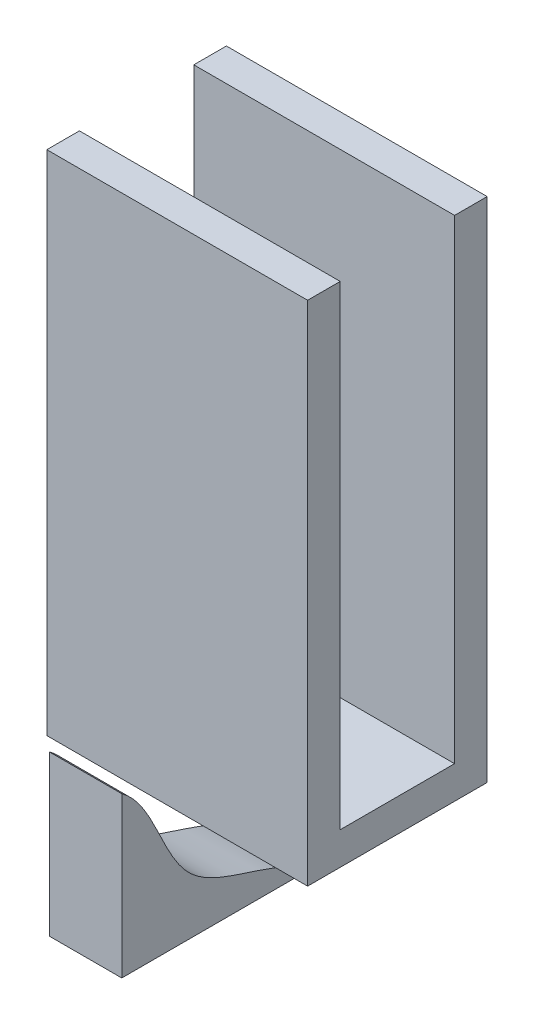
ISO-10303-21;
HEADER;
FILE_DESCRIPTION(('STEP AP214'),'2;1');
FILE_NAME('part.step','',(''),(''),'','','');
FILE_SCHEMA(('AUTOMOTIVE_DESIGN { 1 0 10303 214 1 1 1 1 }'));
ENDSEC;
DATA;
#1=APPLICATION_CONTEXT('core data for automotive mechanical design processes');
#2=APPLICATION_PROTOCOL_DEFINITION('international standard','automotive_design',2000,#1);
#3=PRODUCT_CONTEXT('',#1,'mechanical');
#4=PRODUCT('Part','Part','',(#3));
#5=PRODUCT_RELATED_PRODUCT_CATEGORY('part','',(#4));
#6=PRODUCT_DEFINITION_FORMATION('','',#4);
#7=PRODUCT_DEFINITION_CONTEXT('part definition',#1,'design');
#8=PRODUCT_DEFINITION('design','',#6,#7);
#9=PRODUCT_DEFINITION_SHAPE('','',#8);
#10=(LENGTH_UNIT() NAMED_UNIT(*) SI_UNIT(.MILLI.,.METRE.));
#11=(NAMED_UNIT(*) PLANE_ANGLE_UNIT() SI_UNIT($,.RADIAN.));
#12=(NAMED_UNIT(*) SI_UNIT($,.STERADIAN.) SOLID_ANGLE_UNIT());
#13=UNCERTAINTY_MEASURE_WITH_UNIT(LENGTH_MEASURE(1.E-05),#10,'distance_accuracy_value','');
#14=(GEOMETRIC_REPRESENTATION_CONTEXT(3) GLOBAL_UNCERTAINTY_ASSIGNED_CONTEXT((#13)) GLOBAL_UNIT_ASSIGNED_CONTEXT((#10,
#11,#12)) REPRESENTATION_CONTEXT('',''));
#15=CARTESIAN_POINT('',(0.,0.,0.));
#16=DIRECTION('',(0.,0.,1.));
#17=DIRECTION('',(1.,0.,0.));
#18=AXIS2_PLACEMENT_3D('',#15,#16,#17);
#19=CARTESIAN_POINT('',(-20.,-45.2531458099855,-6.6055019568257));
#20=DIRECTION('',(0.,1.,0.));
#21=DIRECTION('',(0.,0.,1.));
#22=AXIS2_PLACEMENT_3D('',#19,#20,#21);
#23=PLANE('',#22);
#24=DIRECTION('',(1.,0.,0.));
#25=VECTOR('',#24,1.);
#26=CARTESIAN_POINT('',(-20.,-45.2531458099855,10.9381302617935));
#27=LINE('',#26,#25);
#28=CARTESIAN_POINT('',(-20.,-45.2531458099855,10.9381302617935));
#29=VERTEX_POINT('',#28);
#30=CARTESIAN_POINT('',(20.,-45.2531458099855,10.9381302617935));
#31=VERTEX_POINT('',#30);
#32=EDGE_CURVE('E124',#29,#31,#27,.T.);
#33=ORIENTED_EDGE('',*,*,#32,.T.);
#34=DIRECTION('',(0.,0.,1.));
#35=VECTOR('',#34,1.);
#36=CARTESIAN_POINT('',(20.,-45.2531458099855,-6.6055019568257));
#37=LINE('',#36,#35);
#38=CARTESIAN_POINT('',(20.,-45.2531458099855,-6.6055019568257));
#39=VERTEX_POINT('',#38);
#40=EDGE_CURVE('E185',#39,#31,#37,.T.);
#41=ORIENTED_EDGE('',*,*,#40,.F.);
#42=DIRECTION('',(1.,0.,0.));
#43=VECTOR('',#42,1.);
#44=CARTESIAN_POINT('',(-20.,-45.2531458099855,-6.6055019568257));
#45=LINE('',#44,#43);
#46=CARTESIAN_POINT('',(-20.,-45.2531458099855,-6.6055019568257));
#47=VERTEX_POINT('',#46);
#48=EDGE_CURVE('E50',#47,#39,#45,.T.);
#49=ORIENTED_EDGE('',*,*,#48,.F.);
#50=DIRECTION('',(0.,0.,1.));
#51=VECTOR('',#50,1.);
#52=CARTESIAN_POINT('',(-20.,-45.2531458099855,-6.6055019568257));
#53=LINE('',#52,#51);
#54=EDGE_CURVE('E186',#47,#29,#53,.T.);
#55=ORIENTED_EDGE('',*,*,#54,.T.);
#56=EDGE_LOOP('',(#33,#41,#49,#55));
#57=FACE_BOUND('',#56,.T.);
#58=ADVANCED_FACE('F121',(#57),#23,.T.);
#59=CARTESIAN_POINT('',(-20.,-45.2531458099855,-6.6055019568257));
#60=DIRECTION('',(0.,0.,1.));
#61=DIRECTION('',(1.,0.,0.));
#62=AXIS2_PLACEMENT_3D('',#59,#60,#61);
#63=PLANE('',#62);
#64=ORIENTED_EDGE('',*,*,#48,.T.);
#65=DIRECTION('',(0.,-1.,0.));
#66=VECTOR('',#65,1.);
#67=CARTESIAN_POINT('',(20.,-45.2531458099855,-6.6055019568257));
#68=LINE('',#67,#66);
#69=CARTESIAN_POINT('',(20.,27.5804653060911,-6.6055019568257));
#70=VERTEX_POINT('',#69);
#71=EDGE_CURVE('E203',#70,#39,#68,.T.);
#72=ORIENTED_EDGE('',*,*,#71,.F.);
#73=DIRECTION('',(1.,0.,0.));
#74=VECTOR('',#73,1.);
#75=CARTESIAN_POINT('',(-20.,27.5804653060911,-6.6055019568257));
#76=LINE('',#75,#74);
#77=CARTESIAN_POINT('',(-20.,27.5804653060911,-6.6055019568257));
#78=VERTEX_POINT('',#77);
#79=EDGE_CURVE('E129',#78,#70,#76,.T.);
#80=ORIENTED_EDGE('',*,*,#79,.F.);
#81=DIRECTION('',(0.,-1.,0.));
#82=VECTOR('',#81,1.);
#83=CARTESIAN_POINT('',(-20.,-45.2531458099855,-6.6055019568257));
#84=LINE('',#83,#82);
#85=EDGE_CURVE('E191',#78,#47,#84,.T.);
#86=ORIENTED_EDGE('',*,*,#85,.T.);
#87=EDGE_LOOP('',(#64,#72,#80,#86));
#88=FACE_BOUND('',#87,.T.);
#89=ADVANCED_FACE('F267',(#88),#63,.T.);
#90=CARTESIAN_POINT('',(-20.,27.5804653060911,-6.6055019568257));
#91=DIRECTION('',(0.,1.,0.));
#92=DIRECTION('',(0.,0.,1.));
#93=AXIS2_PLACEMENT_3D('',#90,#91,#92);
#94=PLANE('',#93);
#95=ORIENTED_EDGE('',*,*,#79,.T.);
#96=DIRECTION('',(0.,0.,1.));
#97=VECTOR('',#96,1.);
#98=CARTESIAN_POINT('',(20.,27.5804653060911,-6.6055019568257));
#99=LINE('',#98,#97);
#100=CARTESIAN_POINT('',(20.,27.5804653060911,-11.6055019568257));
#101=VERTEX_POINT('',#100);
#102=EDGE_CURVE('E216',#101,#70,#99,.T.);
#103=ORIENTED_EDGE('',*,*,#102,.F.);
#104=DIRECTION('',(1.,0.,0.));
#105=VECTOR('',#104,1.);
#106=CARTESIAN_POINT('',(-20.,27.5804653060911,-11.6055019568257));
#107=LINE('',#106,#105);
#108=CARTESIAN_POINT('',(-20.,27.5804653060911,-11.6055019568257));
#109=VERTEX_POINT('',#108);
#110=EDGE_CURVE('E238',#109,#101,#107,.T.);
#111=ORIENTED_EDGE('',*,*,#110,.F.);
#112=DIRECTION('',(0.,0.,1.));
#113=VECTOR('',#112,1.);
#114=CARTESIAN_POINT('',(-20.,27.5804653060911,-6.6055019568257));
#115=LINE('',#114,#113);
#116=EDGE_CURVE('E234',#109,#78,#115,.T.);
#117=ORIENTED_EDGE('',*,*,#116,.T.);
#118=EDGE_LOOP('',(#95,#103,#111,#117));
#119=FACE_BOUND('',#118,.T.);
#120=ADVANCED_FACE('F266',(#119),#94,.T.);
#121=CARTESIAN_POINT('',(-20.,-50.2531458099855,-11.6055019568257));
#122=DIRECTION('',(0.,0.,-1.));
#123=DIRECTION('',(-1.,0.,0.));
#124=AXIS2_PLACEMENT_3D('',#121,#122,#123);
#125=PLANE('',#124);
#126=ORIENTED_EDGE('',*,*,#110,.T.);
#127=DIRECTION('',(0.,1.,0.));
#128=VECTOR('',#127,1.);
#129=CARTESIAN_POINT('',(20.,-50.2531458099855,-11.6055019568257));
#130=LINE('',#129,#128);
#131=CARTESIAN_POINT('',(20.,-50.2531458099855,-11.6055019568257));
#132=VERTEX_POINT('',#131);
#133=EDGE_CURVE('E213',#132,#101,#130,.T.);
#134=ORIENTED_EDGE('',*,*,#133,.F.);
#135=DIRECTION('',(1.,0.,0.));
#136=VECTOR('',#135,1.);
#137=CARTESIAN_POINT('',(-20.,-50.2531458099855,-11.6055019568257));
#138=LINE('',#137,#136);
#139=CARTESIAN_POINT('',(-20.,-50.2531458099855,-11.6055019568257));
#140=VERTEX_POINT('',#139);
#141=EDGE_CURVE('E240',#140,#132,#138,.T.);
#142=ORIENTED_EDGE('',*,*,#141,.F.);
#143=DIRECTION('',(0.,1.,0.));
#144=VECTOR('',#143,1.);
#145=CARTESIAN_POINT('',(-20.,-50.2531458099855,-11.6055019568257));
#146=LINE('',#145,#144);
#147=EDGE_CURVE('E231',#140,#109,#146,.T.);
#148=ORIENTED_EDGE('',*,*,#147,.T.);
#149=EDGE_LOOP('',(#126,#134,#142,#148));
#150=FACE_BOUND('',#149,.T.);
#151=ADVANCED_FACE('F262',(#150),#125,.T.);
#152=CARTESIAN_POINT('',(-20.,-50.2531458099855,-11.6055019568257));
#153=DIRECTION('',(0.,-1.,0.));
#154=DIRECTION('',(0.,0.,-1.));
#155=AXIS2_PLACEMENT_3D('',#152,#153,#154);
#156=PLANE('',#155);
#157=ORIENTED_EDGE('',*,*,#141,.T.);
#158=DIRECTION('',(0.,0.,-1.));
#159=VECTOR('',#158,1.);
#160=CARTESIAN_POINT('',(20.,-50.2531458099855,-11.6055019568257));
#161=LINE('',#160,#159);
#162=CARTESIAN_POINT('',(20.,-50.2531458099855,15.9381302617935));
#163=VERTEX_POINT('',#162);
#164=EDGE_CURVE('E210',#163,#132,#161,.T.);
#165=ORIENTED_EDGE('',*,*,#164,.F.);
#166=DIRECTION('',(1.,0.,0.));
#167=VECTOR('',#166,1.);
#168=CARTESIAN_POINT('',(-20.,-50.2531458099855,15.9381302617935));
#169=LINE('',#168,#167);
#170=CARTESIAN_POINT('',(-20.,-50.2531458099855,15.9381302617935));
#171=VERTEX_POINT('',#170);
#172=EDGE_CURVE('E242',#171,#163,#169,.T.);
#173=ORIENTED_EDGE('',*,*,#172,.F.);
#174=DIRECTION('',(0.,0.,-1.));
#175=VECTOR('',#174,1.);
#176=CARTESIAN_POINT('',(-20.,-50.2531458099855,-11.6055019568257));
#177=LINE('',#176,#175);
#178=EDGE_CURVE('E228',#171,#140,#177,.T.);
#179=ORIENTED_EDGE('',*,*,#178,.T.);
#180=EDGE_LOOP('',(#157,#165,#173,#179));
#181=FACE_BOUND('',#180,.T.);
#182=ADVANCED_FACE('F255',(#181),#156,.T.);
#183=CARTESIAN_POINT('',(-20.,-50.2531458099855,15.9381302617935));
#184=DIRECTION('',(0.,0.,1.));
#185=DIRECTION('',(1.,0.,0.));
#186=AXIS2_PLACEMENT_3D('',#183,#184,#185);
#187=PLANE('',#186);
#188=ORIENTED_EDGE('',*,*,#172,.T.);
#189=DIRECTION('',(0.,-1.,0.));
#190=VECTOR('',#189,1.);
#191=CARTESIAN_POINT('',(20.,-50.2531458099855,15.9381302617935));
#192=LINE('',#191,#190);
#193=CARTESIAN_POINT('',(20.,27.5804653060911,15.9381302617935));
#194=VERTEX_POINT('',#193);
#195=EDGE_CURVE('E207',#194,#163,#192,.T.);
#196=ORIENTED_EDGE('',*,*,#195,.F.);
#197=DIRECTION('',(1.,0.,0.));
#198=VECTOR('',#197,1.);
#199=CARTESIAN_POINT('',(-20.,27.5804653060911,15.9381302617935));
#200=LINE('',#199,#198);
#201=CARTESIAN_POINT('',(-20.,27.5804653060911,15.9381302617935));
#202=VERTEX_POINT('',#201);
#203=EDGE_CURVE('E244',#202,#194,#200,.T.);
#204=ORIENTED_EDGE('',*,*,#203,.F.);
#205=DIRECTION('',(0.,-1.,0.));
#206=VECTOR('',#205,1.);
#207=CARTESIAN_POINT('',(-20.,-50.2531458099855,15.9381302617935));
#208=LINE('',#207,#206);
#209=EDGE_CURVE('E225',#202,#171,#208,.T.);
#210=ORIENTED_EDGE('',*,*,#209,.T.);
#211=EDGE_LOOP('',(#188,#196,#204,#210));
#212=FACE_BOUND('',#211,.T.);
#213=ADVANCED_FACE('F252',(#212),#187,.T.);
#214=CARTESIAN_POINT('',(-20.,27.5804653060911,15.9381302617935));
#215=DIRECTION('',(0.,1.,0.));
#216=DIRECTION('',(0.,0.,1.));
#217=AXIS2_PLACEMENT_3D('',#214,#215,#216);
#218=PLANE('',#217);
#219=ORIENTED_EDGE('',*,*,#203,.T.);
#220=DIRECTION('',(0.,0.,1.));
#221=VECTOR('',#220,1.);
#222=CARTESIAN_POINT('',(20.,27.5804653060911,15.9381302617935));
#223=LINE('',#222,#221);
#224=CARTESIAN_POINT('',(20.,27.5804653060911,10.9381302617935));
#225=VERTEX_POINT('',#224);
#226=EDGE_CURVE('E198',#225,#194,#223,.T.);
#227=ORIENTED_EDGE('',*,*,#226,.F.);
#228=DIRECTION('',(1.,0.,0.));
#229=VECTOR('',#228,1.);
#230=CARTESIAN_POINT('',(-20.,27.5804653060911,10.9381302617935));
#231=LINE('',#230,#229);
#232=CARTESIAN_POINT('',(-20.,27.5804653060911,10.9381302617935));
#233=VERTEX_POINT('',#232);
#234=EDGE_CURVE('E190',#233,#225,#231,.T.);
#235=ORIENTED_EDGE('',*,*,#234,.F.);
#236=DIRECTION('',(0.,0.,1.));
#237=VECTOR('',#236,1.);
#238=CARTESIAN_POINT('',(-20.,27.5804653060911,15.9381302617935));
#239=LINE('',#238,#237);
#240=EDGE_CURVE('E222',#233,#202,#239,.T.);
#241=ORIENTED_EDGE('',*,*,#240,.T.);
#242=EDGE_LOOP('',(#219,#227,#235,#241));
#243=FACE_BOUND('',#242,.T.);
#244=ADVANCED_FACE('F246',(#243),#218,.T.);
#245=CARTESIAN_POINT('',(-20.,-45.2531458099855,10.9381302617935));
#246=DIRECTION('',(0.,0.,-1.));
#247=DIRECTION('',(-1.,0.,0.));
#248=AXIS2_PLACEMENT_3D('',#245,#246,#247);
#249=PLANE('',#248);
#250=ORIENTED_EDGE('',*,*,#234,.T.);
#251=DIRECTION('',(0.,1.,0.));
#252=VECTOR('',#251,1.);
#253=CARTESIAN_POINT('',(20.,-45.2531458099855,10.9381302617935));
#254=LINE('',#253,#252);
#255=EDGE_CURVE('E193',#31,#225,#254,.T.);
#256=ORIENTED_EDGE('',*,*,#255,.F.);
#257=ORIENTED_EDGE('',*,*,#32,.F.);
#258=DIRECTION('',(0.,1.,0.));
#259=VECTOR('',#258,1.);
#260=CARTESIAN_POINT('',(-20.,-45.2531458099855,10.9381302617935));
#261=LINE('',#260,#259);
#262=EDGE_CURVE('E220',#29,#233,#261,.T.);
#263=ORIENTED_EDGE('',*,*,#262,.T.);
#264=EDGE_LOOP('',(#250,#256,#257,#263));
#265=FACE_BOUND('',#264,.T.);
#266=ADVANCED_FACE('F194',(#265),#249,.T.);
#267=CARTESIAN_POINT('',(-20.,0.,-70.));
#268=DIRECTION('',(-1.,0.,0.));
#269=DIRECTION('',(0.,0.,1.));
#270=AXIS2_PLACEMENT_3D('',#267,#268,#269);
#271=PLANE('',#270);
#272=ORIENTED_EDGE('',*,*,#54,.F.);
#273=ORIENTED_EDGE('',*,*,#85,.F.);
#274=ORIENTED_EDGE('',*,*,#116,.F.);
#275=ORIENTED_EDGE('',*,*,#147,.F.);
#276=ORIENTED_EDGE('',*,*,#178,.F.);
#277=ORIENTED_EDGE('',*,*,#209,.F.);
#278=ORIENTED_EDGE('',*,*,#240,.F.);
#279=ORIENTED_EDGE('',*,*,#262,.F.);
#280=EDGE_LOOP('',(#272,#273,#274,#275,#276,#277,#278,#279));
#281=FACE_BOUND('',#280,.T.);
#282=ADVANCED_FACE('F258',(#281),#271,.T.);
#283=CARTESIAN_POINT('',(20.,0.,-70.));
#284=DIRECTION('',(-1.,0.,0.));
#285=DIRECTION('',(0.,0.,1.));
#286=AXIS2_PLACEMENT_3D('',#283,#284,#285);
#287=PLANE('',#286);
#288=ORIENTED_EDGE('',*,*,#40,.T.);
#289=ORIENTED_EDGE('',*,*,#255,.T.);
#290=ORIENTED_EDGE('',*,*,#226,.T.);
#291=ORIENTED_EDGE('',*,*,#195,.T.);
#292=ORIENTED_EDGE('',*,*,#164,.T.);
#293=ORIENTED_EDGE('',*,*,#133,.T.);
#294=ORIENTED_EDGE('',*,*,#102,.T.);
#295=ORIENTED_EDGE('',*,*,#71,.T.);
#296=EDGE_LOOP('',(#288,#289,#290,#291,#292,#293,#294,#295));
#297=FACE_BOUND('',#296,.T.);
#298=ADVANCED_FACE('F201',(#297),#287,.F.);
#299=CLOSED_SHELL('',(#58,#89,#120,#151,#182,#213,#244,#266,#282,#298));
#300=MANIFOLD_SOLID_BREP('B6',#299);
#301=CARTESIAN_POINT('',(0.,-36.8210870869659,40.5237731026121));
#302=CARTESIAN_POINT('',(0.,-33.3118553670702,25.1176072235687));
#303=CARTESIAN_POINT('',(0.,-61.7215890433346,26.7426652328646));
#304=CARTESIAN_POINT('',(0.,-57.8458147883083,0.702636395193637));
#305=CARTESIAN_POINT('',(0.,-68.3475748648418,-2.08737019533879));
#306=B_SPLINE_CURVE_WITH_KNOTS('',3,(#301,#302,#303,#304,#305),.UNSPECIFIED.,.F.,.F.,(4,1,4),
(0.,0.518621459530431,1.),.UNSPECIFIED.);
#307=DIRECTION('',(1.,0.,0.));
#308=VECTOR('',#307,1.);
#309=SURFACE_OF_LINEAR_EXTRUSION('',#306,#308);
#310=OFFSET_SURFACE('',#309,0.02,.F.);
#311=DIRECTION('',(1.,0.,0.));
#312=VECTOR('',#311,1.);
#313=CARTESIAN_POINT('',(0.,-38.1621288129392,30.));
#314=LINE('',#313,#312);
#315=CARTESIAN_POINT('',(-5.5576064521285,-38.1621288129392,30.));
#316=VERTEX_POINT('',#315);
#317=CARTESIAN_POINT('',(5.5576064521285,-38.1621288129392,30.));
#318=VERTEX_POINT('',#317);
#319=EDGE_CURVE('E119',#316,#318,#314,.T.);
#320=ORIENTED_EDGE('',*,*,#319,.T.);
#321=CARTESIAN_POINT('',(5.5576064521285,-38.162128812939,30.0000000000001));
#322=CARTESIAN_POINT('',(5.5576064521285,-38.2390356697093,29.8932156569232));
#323=CARTESIAN_POINT('',(5.5576064521285,-38.3180935265017,29.7880025490872));
#324=CARTESIAN_POINT('',(5.5576064521285,-38.4802518566458,29.5807654114079));
#325=CARTESIAN_POINT('',(5.5576064521285,-38.56335166793,29.4787408637492));
#326=CARTESIAN_POINT('',(5.5576064521285,-38.81757188996,29.1784040563975));
#327=CARTESIAN_POINT('',(5.5576064521285,-38.9943342558284,28.9848334944389));
#328=CARTESIAN_POINT('',(5.5576064521285,-39.3604515569888,28.6105681302833));
#329=CARTESIAN_POINT('',(5.5576064521285,-39.5497904730152,28.4298575335943));
#330=CARTESIAN_POINT('',(5.5576064521285,-39.9352725684418,28.0838762866036));
#331=CARTESIAN_POINT('',(5.5576064521285,-40.1312048756993,27.9183696646933));
#332=CARTESIAN_POINT('',(5.5576064521285,-40.5317121870961,27.5977867919598));
#333=CARTESIAN_POINT('',(5.5576064521285,-40.7362958300207,27.4427213876911));
#334=CARTESIAN_POINT('',(5.5576064521285,-41.152390227305,27.1420697138918));
#335=CARTESIAN_POINT('',(5.5576064521285,-41.363903452875,26.996486882554));
#336=CARTESIAN_POINT('',(5.5576064521285,-41.8523346456861,26.6741365107189));
#337=CARTESIAN_POINT('',(5.5576064521285,-42.1310043153771,26.5000309952204));
#338=CARTESIAN_POINT('',(5.5576064521285,-42.6948931228931,26.1630220700723));
#339=CARTESIAN_POINT('',(5.5576064521285,-42.9801108025325,26.000116198025));
#340=CARTESIAN_POINT('',(5.5576064521285,-43.5553064677531,25.6829641473879));
#341=CARTESIAN_POINT('',(5.5576064521285,-43.8452846583786,25.5287183430752));
#342=CARTESIAN_POINT('',(5.5576064521285,-44.431265247978,25.2250503381148));
#343=CARTESIAN_POINT('',(5.5576064521285,-44.7272987500749,25.0756885766084));
#344=CARTESIAN_POINT('',(5.5576064521285,-45.3213149264399,24.7810015965398));
#345=CARTESIAN_POINT('',(5.5576064521285,-45.6192973857167,24.635675941729));
#346=CARTESIAN_POINT('',(5.5576064521285,-46.2160880606755,24.3467368814545));
#347=CARTESIAN_POINT('',(5.5576064521285,-46.514896280846,24.2031234853205));
#348=CARTESIAN_POINT('',(5.5576064521285,-47.0553109454691,23.9427512787087));
#349=CARTESIAN_POINT('',(5.5576064521285,-47.296964782588,23.826091249524));
#350=CARTESIAN_POINT('',(5.5576064521285,-47.7794920738743,23.5911748814192));
#351=CARTESIAN_POINT('',(5.5576064521285,-48.0203655452178,23.4729185779337));
#352=CARTESIAN_POINT('',(5.5576064521285,-48.5007154393345,23.233546927066));
#353=CARTESIAN_POINT('',(5.5576064521285,-48.7401917611856,23.1124313762602));
#354=CARTESIAN_POINT('',(5.5576064521285,-49.2170975329748,22.8660098648867));
#355=CARTESIAN_POINT('',(5.5576064521285,-49.4545262184846,22.7407024179066));
#356=CARTESIAN_POINT('',(5.5576064521285,-49.9246889047321,22.4855227482267));
#357=CARTESIAN_POINT('',(5.5576064521285,-50.1574445297613,22.3556905555566));
#358=CARTESIAN_POINT('',(5.5576064521285,-50.6190497028233,22.0892281820119));
#359=CARTESIAN_POINT('',(5.5576064521285,-50.8478992838646,21.9525980586221));
#360=CARTESIAN_POINT('',(5.5576064521285,-51.3004362816496,21.671160974459));
#361=CARTESIAN_POINT('',(5.5576064521285,-51.5241253331357,21.5263566546197));
#362=CARTESIAN_POINT('',(5.5576064521285,-51.9650241191155,21.2270604883043));
#363=CARTESIAN_POINT('',(5.5576064521285,-52.1822328813918,21.0725671989009));
#364=CARTESIAN_POINT('',(5.5576064521285,-52.5472320327118,20.7984527516213));
#365=CARTESIAN_POINT('',(5.5576064521285,-52.6970593008714,20.6815438081119));
#366=CARTESIAN_POINT('',(5.5576064521285,-52.9917806998285,20.4416430857625));
#367=CARTESIAN_POINT('',(5.5576064521285,-53.136674832653,20.3186513094219));
#368=CARTESIAN_POINT('',(5.5576064521285,-53.4206372945255,20.0662586006321));
#369=CARTESIAN_POINT('',(5.5576064521285,-53.5597088702142,19.9368613301393));
#370=CARTESIAN_POINT('',(5.5576064521285,-53.8311766717152,19.6713663279983));
#371=CARTESIAN_POINT('',(5.5576064521285,-53.9635765187155,19.5352723121594));
#372=CARTESIAN_POINT('',(5.5576064521285,-54.2206270455287,19.2563551878688));
#373=CARTESIAN_POINT('',(5.5576064521285,-54.3452898710311,19.1135432784799));
#374=CARTESIAN_POINT('',(5.5576064521285,-54.5872246449341,18.8216711204131));
#375=CARTESIAN_POINT('',(5.5576064521285,-54.7044923477381,18.6726073628072));
#376=CARTESIAN_POINT('',(5.5576064521285,-54.9318678205941,18.3690094127681));
#377=CARTESIAN_POINT('',(5.5576064521285,-55.041971952394,18.214472501204));
#378=CARTESIAN_POINT('',(5.5576064521285,-55.2552913175542,17.9007492085909));
#379=CARTESIAN_POINT('',(5.5576064521285,-55.3585070246038,17.7415631483295));
#380=CARTESIAN_POINT('',(5.5576064521285,-55.6240705301056,17.3134912217004));
#381=CARTESIAN_POINT('',(5.5576064521285,-55.7808124312108,17.0411186317341));
#382=CARTESIAN_POINT('',(5.5576064521285,-56.0788805628699,16.4880594803882));
#383=CARTESIAN_POINT('',(5.5576064521285,-56.2202023343614,16.2073705438368));
#384=CARTESIAN_POINT('',(5.5576064521285,-56.4899212110672,15.6395966624294));
#385=CARTESIAN_POINT('',(5.5576064521285,-56.6183071033885,15.3525064276762));
#386=CARTESIAN_POINT('',(5.5576064521285,-56.8644201061225,14.7737883647159));
#387=CARTESIAN_POINT('',(5.5576064521285,-56.9821458674491,14.4821599676419));
#388=CARTESIAN_POINT('',(5.5576064521285,-57.2108595814445,13.8914391888251));
#389=CARTESIAN_POINT('',(5.5576064521285,-57.3217253707133,13.5922998663514));
#390=CARTESIAN_POINT('',(5.5576064521285,-57.5370127609398,12.9919846918133));
#391=CARTESIAN_POINT('',(5.5576064521285,-57.6414391715037,12.6908105507955));
#392=CARTESIAN_POINT('',(5.5576064521285,-57.8460409595757,12.0871320210797));
#393=CARTESIAN_POINT('',(5.5576064521285,-57.9462175890702,11.7846280535421));
#394=CARTESIAN_POINT('',(5.5576064521285,-58.1443705031992,11.1789504729972));
#395=CARTESIAN_POINT('',(5.5576064521285,-58.2423470794864,10.8757769546726));
#396=CARTESIAN_POINT('',(5.5576064521285,-58.486789625299,10.1184469191766));
#397=CARTESIAN_POINT('',(5.5576064521285,-58.6331187084805,9.66424612682074));
#398=CARTESIAN_POINT('',(5.5576064521285,-58.9318264571351,8.75769559851139));
#399=CARTESIAN_POINT('',(5.5576064521285,-59.0842064521975,8.30534629374904));
#400=CARTESIAN_POINT('',(5.5576064521285,-59.401807964397,7.40449492511458));
#401=CARTESIAN_POINT('',(5.5576064521285,-59.5670446919093,6.95599813721423));
#402=CARTESIAN_POINT('',(5.5576064521285,-59.9146141257867,6.07314424093666));
#403=CARTESIAN_POINT('',(5.5576064521285,-60.0966603418787,5.6386762180847));
#404=CARTESIAN_POINT('',(5.5576064521285,-60.4866287879703,4.7818715273882));
#405=CARTESIAN_POINT('',(5.5576064521285,-60.6945248227801,4.35952310381369));
#406=CARTESIAN_POINT('',(5.5576064521285,-61.142914235248,3.53326310956838));
#407=CARTESIAN_POINT('',(5.5576064521285,-61.3833387853394,3.12931495486531));
#408=CARTESIAN_POINT('',(5.5576064521285,-61.7952102425505,2.50926046618572));
#409=CARTESIAN_POINT('',(5.5576064521285,-61.9539355346683,2.28470227482413));
#410=CARTESIAN_POINT('',(5.5576064521285,-62.2031779655602,1.95507777710684));
#411=CARTESIAN_POINT('',(5.5576064521285,-62.2884439152264,1.8460271402991));
#412=CARTESIAN_POINT('',(5.5576064521285,-62.4626156626145,1.63086777537261));
#413=CARTESIAN_POINT('',(5.5576064521285,-62.5515215832558,1.52475914680677));
#414=CARTESIAN_POINT('',(5.5576064521285,-62.642280007554,1.42024216723639));
#415=B_SPLINE_CURVE_WITH_KNOTS('',3,(#321,#322,#323,#324,#325,#326,#327,#328,#329,#330,#331,
#332,#333,#334,#335,#336,#337,#338,#339,#340,#341,#342,#343,#344,#345,#346,#347,#348,#349,#350,
#351,#352,#353,#354,#355,#356,#357,#358,#359,#360,#361,#362,#363,#364,#365,#366,#367,#368,#369,
#370,#371,#372,#373,#374,#375,#376,#377,#378,#379,#380,#381,#382,#383,#384,#385,#386,#387,#388,
#389,#390,#391,#392,#393,#394,#395,#396,#397,#398,#399,#400,#401,#402,#403,#404,#405,#406,#407,
#408,#409,#410,#411,#412,#413,#414),.UNSPECIFIED.,.F.,.F.,(4,2,2,2,2,2,2,2,2,2,2,2,2,2,2,2,2,2,
2,2,2,2,2,2,2,2,2,2,2,2,2,2,2,2,2,2,2,2,2,2,2,2,2,2,2,2,4),(0.,0.394729970486916,
0.789395500994888,1.5750495323275,2.35972135370753,3.12875155870454,3.89856870136028,
4.66866342830044,5.65407913956631,6.63927749595816,7.62451839864336,8.61920713977163,
9.61378794674,10.6083741704187,11.4133913268768,12.2183906426453,13.0234474044137,
13.8287927234215,14.6282553022924,15.4277111218549,16.2269101138616,17.0262284103093,
17.5962157844879,18.1662029244631,18.7358678892861,19.3052202532634,19.8736549706172,
20.4424131142361,21.0114579008817,21.5804635162002,22.5225809797653,23.4649701588747,
24.4081693030331,25.3514876468091,26.308457460538,27.2647036276782,28.2206660999603,
29.1765010867887,30.6080695922016,32.0399544212616,33.4735598048514,34.8861255841463,
36.2972714159145,37.7054767655484,38.5299221611118,38.9451336429348,39.3603591577522),.UNSPECIFIED.);
#416=CARTESIAN_POINT('',(5.5576064521285,-62.6422800075539,1.42024216723646));
#417=VERTEX_POINT('',#416);
#418=EDGE_CURVE('E395',#318,#417,#415,.T.);
#419=ORIENTED_EDGE('',*,*,#418,.T.);
#420=DIRECTION('',(1.,0.,0.));
#421=VECTOR('',#420,1.);
#422=CARTESIAN_POINT('',(0.,-62.6422800075539,1.42024216723646));
#423=LINE('',#422,#421);
#424=CARTESIAN_POINT('',(-5.5576064521285,-62.6422800075539,1.42024216723637));
#425=VERTEX_POINT('',#424);
#426=EDGE_CURVE('E364',#417,#425,#423,.F.);
#427=ORIENTED_EDGE('',*,*,#426,.T.);
#428=CARTESIAN_POINT('',(-5.5576064521285,-62.6422800075539,1.42024216723637));
#429=CARTESIAN_POINT('',(-5.5576064521285,-62.5176472780284,1.56375624980629));
#430=CARTESIAN_POINT('',(-5.5576064521285,-62.3965194507304,1.71027694907435));
#431=CARTESIAN_POINT('',(-5.5576064521285,-62.1611188732568,2.00864464980485));
#432=CARTESIAN_POINT('',(-5.5576064521285,-62.0468436645718,2.16048970968874));
#433=CARTESIAN_POINT('',(-5.5576064521285,-61.8266398713068,2.46651121909632));
#434=CARTESIAN_POINT('',(-5.5576064521285,-61.7206086815497,2.62061403800985));
#435=CARTESIAN_POINT('',(-5.5576064521285,-61.5146526445213,2.9328527654522));
#436=CARTESIAN_POINT('',(-5.5576064521285,-61.4147283377893,3.09098902924298));
#437=CARTESIAN_POINT('',(-5.5576064521285,-61.1251896231754,3.56803699932292));
#438=CARTESIAN_POINT('',(-5.5576064521285,-60.9440253340075,3.89210163985537));
#439=CARTESIAN_POINT('',(-5.5576064521285,-60.6018065943958,4.54930704807927));
#440=CARTESIAN_POINT('',(-5.5576064521285,-60.4406938295618,4.88241789346991));
#441=CARTESIAN_POINT('',(-5.5576064521285,-60.1345283488858,5.55586414824773));
#442=CARTESIAN_POINT('',(-5.5576064521285,-59.989474937074,5.89619924379268));
#443=CARTESIAN_POINT('',(-5.5576064521285,-59.7095762613506,6.58800889288327));
#444=CARTESIAN_POINT('',(-5.5576064521285,-59.5749571380415,6.93957399050714));
#445=CARTESIAN_POINT('',(-5.5576064521285,-59.3150836082193,7.64698821186142));
#446=CARTESIAN_POINT('',(-5.5576064521285,-59.1898503875174,8.00284504012952));
#447=CARTESIAN_POINT('',(-5.5576064521285,-58.9455068984731,8.71734900369193));
#448=CARTESIAN_POINT('',(-5.5576064521285,-58.8264080693909,9.0760000113601));
#449=CARTESIAN_POINT('',(-5.5576064521285,-58.5912033285362,9.79463271142257));
#450=CARTESIAN_POINT('',(-5.5576064521285,-58.4751002380248,10.1546153175469));
#451=CARTESIAN_POINT('',(-5.5576064521285,-58.2427847395248,10.8744612754596));
#452=CARTESIAN_POINT('',(-5.5576064521285,-58.1265723604593,11.2343246362357));
#453=CARTESIAN_POINT('',(-5.5576064521285,-57.9222365041432,11.8569128538219));
#454=CARTESIAN_POINT('',(-5.5576064521285,-57.8349061956867,12.1198963346254));
#455=CARTESIAN_POINT('',(-5.5576064521285,-57.657129889454,12.6446016470952));
#456=CARTESIAN_POINT('',(-5.5576064521285,-57.5666861959522,12.9063242550898));
#457=CARTESIAN_POINT('',(-5.5576064521285,-57.3812579346402,13.4280805193278));
#458=CARTESIAN_POINT('',(-5.5576064521285,-57.2862746820724,13.6881146402705));
#459=CARTESIAN_POINT('',(-5.5576064521285,-57.090238356975,14.2060311570101));
#460=CARTESIAN_POINT('',(-5.5576064521285,-56.9891826015254,14.4639125435337));
#461=CARTESIAN_POINT('',(-5.5576064521285,-56.7809857420488,14.9729666187235));
#462=CARTESIAN_POINT('',(-5.5576064521285,-56.6739510959372,15.2241825940839));
#463=CARTESIAN_POINT('',(-5.5576064521285,-56.4509645046147,15.7227004667281));
#464=CARTESIAN_POINT('',(-5.5576064521285,-56.3350110925508,15.9700017120639));
#465=CARTESIAN_POINT('',(-5.5576064521285,-56.0926716779985,16.4593444053179));
#466=CARTESIAN_POINT('',(-5.5576064521285,-55.9662898584471,16.7013879134258));
#467=CARTESIAN_POINT('',(-5.5576064521285,-55.7014826135087,17.1788430945345));
#468=CARTESIAN_POINT('',(-5.5576064521285,-55.5630574387557,17.4142549054125));
#469=CARTESIAN_POINT('',(-5.5576064521285,-55.3124025719355,17.8134463963207));
#470=CARTESIAN_POINT('',(-5.5576064521285,-55.2033508606291,17.9792220516169));
#471=CARTESIAN_POINT('',(-5.5576064521285,-54.9776472747188,18.3055350300015));
#472=CARTESIAN_POINT('',(-5.5576064521285,-54.8609953311749,18.4660723055539));
#473=CARTESIAN_POINT('',(-5.5576064521285,-54.6197739503446,18.780967742221));
#474=CARTESIAN_POINT('',(-5.5576064521285,-54.4952091002455,18.935329400316));
#475=CARTESIAN_POINT('',(-5.5576064521285,-54.3022688508556,19.1615836395082));
#476=CARTESIAN_POINT('',(-5.5576064521285,-54.2369564646701,19.2361029671458));
#477=CARTESIAN_POINT('',(-5.5576064521285,-54.104262324928,19.3832756773387));
#478=CARTESIAN_POINT('',(-5.5576064521285,-54.0368805806248,19.4559290682351));
#479=CARTESIAN_POINT('',(-5.5576064521285,-53.8315616189492,19.6712868835348));
#480=CARTESIAN_POINT('',(-5.5576064521285,-53.6906427566816,19.8111638726514));
#481=CARTESIAN_POINT('',(-5.5576064521285,-53.4018608030607,20.0837035027849));
#482=CARTESIAN_POINT('',(-5.5576064521285,-53.2539933254157,20.2163614696475));
#483=CARTESIAN_POINT('',(-5.5576064521285,-52.9522584233537,20.4748470505819));
#484=CARTESIAN_POINT('',(-5.5576064521285,-52.7983873463721,20.6006703915422));
#485=CARTESIAN_POINT('',(-5.5576064521285,-52.4856315736009,20.8458792549114));
#486=CARTESIAN_POINT('',(-5.5576064521285,-52.326747100995,20.9652650632638));
#487=CARTESIAN_POINT('',(-5.5576064521285,-51.8846597675405,21.2850196754778));
#488=CARTESIAN_POINT('',(-5.5576064521285,-51.5971094461581,21.4793855452575));
#489=CARTESIAN_POINT('',(-5.5576064521285,-51.0126542147425,21.8533365002499));
#490=CARTESIAN_POINT('',(-5.5576064521285,-50.7157488430203,22.0329208543825));
#491=CARTESIAN_POINT('',(-5.5576064521285,-50.1150347686988,22.3806172866707));
#492=CARTESIAN_POINT('',(-5.5576064521285,-49.8112208880845,22.5487203545276));
#493=CARTESIAN_POINT('',(-5.5576064521285,-49.1989741145987,22.8763618627937));
#494=CARTESIAN_POINT('',(-5.5576064521285,-48.8905403524931,23.0358986648934));
#495=CARTESIAN_POINT('',(-5.5576064521285,-48.2676133351515,23.3508603135076));
#496=CARTESIAN_POINT('',(-5.5576064521285,-47.9530903844584,23.506225994416));
#497=CARTESIAN_POINT('',(-5.5576064521285,-47.3228030389596,23.8138283021802));
#498=CARTESIAN_POINT('',(-5.5576064521285,-47.0070396725599,23.9660670523765));
#499=CARTESIAN_POINT('',(-5.5576064521285,-46.3754836353655,24.2702017733977));
#500=CARTESIAN_POINT('',(-5.5576064521285,-46.0596910125434,24.4220978446287));
#501=CARTESIAN_POINT('',(-5.5576064521285,-45.429270768208,24.7282966973307));
#502=CARTESIAN_POINT('',(-5.5576064521285,-45.1146431312727,24.8825994468003));
#503=CARTESIAN_POINT('',(-5.5576064521285,-44.5085101288459,25.1860562580292));
#504=CARTESIAN_POINT('',(-5.5576064521285,-44.2168423132253,25.334883708534));
#505=CARTESIAN_POINT('',(-5.5576064521285,-43.6369923002123,25.6393687473622));
#506=CARTESIAN_POINT('',(-5.5576064521285,-43.3488108390759,25.795027747342));
#507=CARTESIAN_POINT('',(-5.5576064521285,-42.7774176541858,26.1156328399682));
#508=CARTESIAN_POINT('',(-5.5576064521285,-42.4942087253697,26.2805839492837));
#509=CARTESIAN_POINT('',(-5.5576064521285,-41.9378409506865,26.6203779327666));
#510=CARTESIAN_POINT('',(-5.5576064521285,-41.6646074687476,26.795097663017));
#511=CARTESIAN_POINT('',(-5.5576064521285,-41.1275818975133,27.1583388340119));
#512=CARTESIAN_POINT('',(-5.5576064521285,-40.8637857955953,27.3468543026467));
#513=CARTESIAN_POINT('',(-5.5576064521285,-40.3486656169367,27.7399194546816));
#514=CARTESIAN_POINT('',(-5.5576064521285,-40.0973303765214,27.9444543463363));
#515=CARTESIAN_POINT('',(-5.5576064521285,-39.6977480256901,28.2950228701937));
#516=CARTESIAN_POINT('',(-5.5576064521285,-39.544838052385,28.4357509947619));
#517=CARTESIAN_POINT('',(-5.5576064521285,-39.2465863037928,28.7249837069012));
#518=CARTESIAN_POINT('',(-5.5576064521285,-39.1012430502984,28.8734867641338));
#519=CARTESIAN_POINT('',(-5.5576064521285,-38.8176954891935,29.1801217916385));
#520=CARTESIAN_POINT('',(-5.5576064521285,-38.6795831453904,29.3383391173526));
#521=CARTESIAN_POINT('',(-5.5576064521285,-38.4131792577354,29.6630198609544));
#522=CARTESIAN_POINT('',(-5.5576064521285,-38.2848949754827,29.8294892292211));
#523=CARTESIAN_POINT('',(-5.5576064521285,-38.1621288129391,30.0000000000001));
#524=B_SPLINE_CURVE_WITH_KNOTS('',3,(#428,#429,#430,#431,#432,#433,#434,#435,#436,#437,#438,
#439,#440,#441,#442,#443,#444,#445,#446,#447,#448,#449,#450,#451,#452,#453,#454,#455,#456,#457,
#458,#459,#460,#461,#462,#463,#464,#465,#466,#467,#468,#469,#470,#471,#472,#473,#474,#475,#476,
#477,#478,#479,#480,#481,#482,#483,#484,#485,#486,#487,#488,#489,#490,#491,#492,#493,#494,#495,
#496,#497,#498,#499,#500,#501,#502,#503,#504,#505,#506,#507,#508,#509,#510,#511,#512,#513,#514,
#515,#516,#517,#518,#519,#520,#521,#522,#523),.UNSPECIFIED.,.F.,.F.,(4,2,2,2,2,2,2,2,2,2,2,2,2,
2,2,2,2,2,2,2,2,2,2,2,2,2,2,2,2,2,2,2,2,2,2,2,2,2,2,2,2,2,2,2,2,2,2,4),(0.,0.570136731686996,
1.14006767668343,1.70108289638935,2.26214770158922,3.37505294550911,4.48464197260981,
5.59418289422512,6.72336360141577,7.85502078001091,8.98871703996992,10.1234446388278,
11.2579278934408,12.0892291039036,12.9199277500424,13.7503871606108,14.5812162170587,
15.4002782144692,16.2194752107237,17.0383452015558,17.8571981549752,18.4522945241037,
19.0473962919821,19.6421561675178,19.9393924181015,20.2366273397395,20.8319836129446,
21.4277208882319,22.0238264388886,22.6199054897774,23.6605130342483,24.7011720153272,
25.7426385186565,26.7843034995048,27.8366817432597,28.888320020916,29.9395942985433,
30.9908546093432,31.9731282316457,32.9556057934011,33.938618960413,34.911230010895,
35.8834224852921,36.8547276229809,37.4779198914565,38.1009899549332,38.7306621353555,
39.3607951585227),.UNSPECIFIED.);
#525=EDGE_CURVE('E372',#425,#316,#524,.T.);
#526=ORIENTED_EDGE('',*,*,#525,.T.);
#527=EDGE_LOOP('',(#320,#419,#427,#526));
#528=FACE_BOUND('',#527,.T.);
#529=ADVANCED_FACE('F348',(#528),#310,.F.);
#530=CARTESIAN_POINT('',(5.5576064521285,-13.9324445279089,-30.));
#531=DIRECTION('',(1.,0.,0.));
#532=DIRECTION('',(0.,1.,0.));
#533=AXIS2_PLACEMENT_3D('',#530,#531,#532);
#534=PLANE('',#533);
#535=ORIENTED_EDGE('',*,*,#418,.F.);
#536=DIRECTION('',(0.,1.,0.));
#537=VECTOR('',#536,1.);
#538=CARTESIAN_POINT('',(5.5576064521285,-13.9324445279089,30.));
#539=LINE('',#538,#537);
#540=CARTESIAN_POINT('',(5.5576064521285,-62.6422800075539,30.));
#541=VERTEX_POINT('',#540);
#542=EDGE_CURVE('E385',#541,#318,#539,.T.);
#543=ORIENTED_EDGE('',*,*,#542,.F.);
#544=DIRECTION('',(0.,0.,1.));
#545=VECTOR('',#544,1.);
#546=CARTESIAN_POINT('',(5.5576064521285,-62.6422800075539,-30.));
#547=LINE('',#546,#545);
#548=EDGE_CURVE('E357',#417,#541,#547,.T.);
#549=ORIENTED_EDGE('',*,*,#548,.F.);
#550=EDGE_LOOP('',(#535,#543,#549));
#551=FACE_BOUND('',#550,.T.);
#552=ADVANCED_FACE('F396',(#551),#534,.T.);
#553=CARTESIAN_POINT('',(-5.5576064521285,-62.6422800075539,-30.));
#554=DIRECTION('',(0.,-1.,0.));
#555=DIRECTION('',(0.,0.,-1.));
#556=AXIS2_PLACEMENT_3D('',#553,#554,#555);
#557=PLANE('',#556);
#558=ORIENTED_EDGE('',*,*,#426,.F.);
#559=ORIENTED_EDGE('',*,*,#548,.T.);
#560=DIRECTION('',(1.,0.,0.));
#561=VECTOR('',#560,1.);
#562=CARTESIAN_POINT('',(-5.5576064521285,-62.6422800075539,30.));
#563=LINE('',#562,#561);
#564=CARTESIAN_POINT('',(-5.5576064521285,-62.6422800075539,30.));
#565=VERTEX_POINT('',#564);
#566=EDGE_CURVE('E390',#565,#541,#563,.T.);
#567=ORIENTED_EDGE('',*,*,#566,.F.);
#568=DIRECTION('',(0.,0.,1.));
#569=VECTOR('',#568,1.);
#570=CARTESIAN_POINT('',(-5.5576064521285,-62.6422800075539,-30.));
#571=LINE('',#570,#569);
#572=EDGE_CURVE('E392',#425,#565,#571,.T.);
#573=ORIENTED_EDGE('',*,*,#572,.F.);
#574=EDGE_LOOP('',(#558,#559,#567,#573));
#575=FACE_BOUND('',#574,.T.);
#576=ADVANCED_FACE('F424',(#575),#557,.T.);
#577=CARTESIAN_POINT('',(-5.5576064521285,-13.9324445279089,-30.));
#578=DIRECTION('',(-1.,0.,0.));
#579=DIRECTION('',(0.,0.,1.));
#580=AXIS2_PLACEMENT_3D('',#577,#578,#579);
#581=PLANE('',#580);
#582=ORIENTED_EDGE('',*,*,#525,.F.);
#583=ORIENTED_EDGE('',*,*,#572,.T.);
#584=DIRECTION('',(0.,-1.,0.));
#585=VECTOR('',#584,1.);
#586=CARTESIAN_POINT('',(-5.5576064521285,-13.9324445279089,30.));
#587=LINE('',#586,#585);
#588=EDGE_CURVE('E398',#316,#565,#587,.T.);
#589=ORIENTED_EDGE('',*,*,#588,.F.);
#590=EDGE_LOOP('',(#582,#583,#589));
#591=FACE_BOUND('',#590,.T.);
#592=ADVANCED_FACE('F350',(#591),#581,.T.);
#593=CARTESIAN_POINT('',(0.,0.,30.));
#594=DIRECTION('',(0.,0.,1.));
#595=DIRECTION('',(1.,0.,0.));
#596=AXIS2_PLACEMENT_3D('',#593,#594,#595);
#597=PLANE('',#596);
#598=ORIENTED_EDGE('',*,*,#319,.F.);
#599=ORIENTED_EDGE('',*,*,#588,.T.);
#600=ORIENTED_EDGE('',*,*,#566,.T.);
#601=ORIENTED_EDGE('',*,*,#542,.T.);
#602=EDGE_LOOP('',(#598,#599,#600,#601));
#603=FACE_BOUND('',#602,.T.);
#604=ADVANCED_FACE('F387',(#603),#597,.T.);
#605=CLOSED_SHELL('',(#529,#552,#576,#592,#604));
#606=MANIFOLD_SOLID_BREP('B44',#605);
#607=ADVANCED_BREP_SHAPE_REPRESENTATION('',(#18,#300,#606),#14);
#608=SHAPE_DEFINITION_REPRESENTATION(#9,#607);
ENDSEC;
END-ISO-10303-21;
